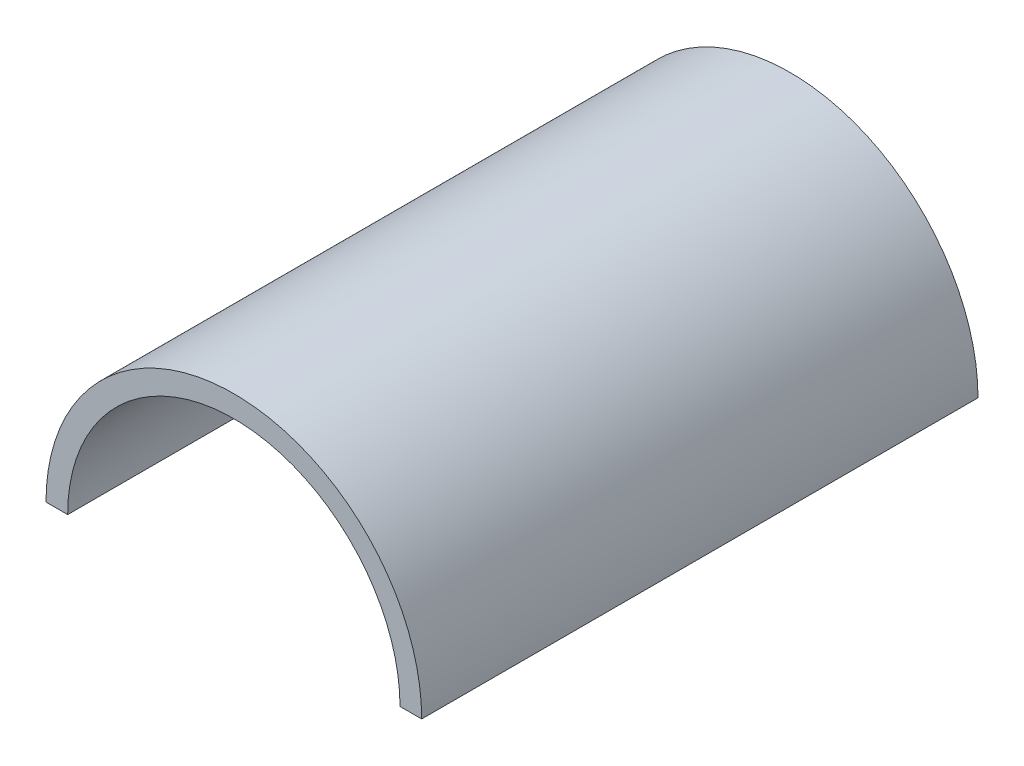
ISO-10303-21;
HEADER;
FILE_DESCRIPTION(('STEP AP214'),'2;1');
FILE_NAME('part.step','',(''),(''),'','','');
FILE_SCHEMA(('AUTOMOTIVE_DESIGN { 1 0 10303 214 1 1 1 1 }'));
ENDSEC;
DATA;
#1=APPLICATION_CONTEXT('core data for automotive mechanical design processes');
#2=APPLICATION_PROTOCOL_DEFINITION('international standard','automotive_design',2000,#1);
#3=PRODUCT_CONTEXT('',#1,'mechanical');
#4=PRODUCT('Part','Part','',(#3));
#5=PRODUCT_RELATED_PRODUCT_CATEGORY('part','',(#4));
#6=PRODUCT_DEFINITION_FORMATION('','',#4);
#7=PRODUCT_DEFINITION_CONTEXT('part definition',#1,'design');
#8=PRODUCT_DEFINITION('design','',#6,#7);
#9=PRODUCT_DEFINITION_SHAPE('','',#8);
#10=(LENGTH_UNIT() NAMED_UNIT(*) SI_UNIT(.MILLI.,.METRE.));
#11=(NAMED_UNIT(*) PLANE_ANGLE_UNIT() SI_UNIT($,.RADIAN.));
#12=(NAMED_UNIT(*) SI_UNIT($,.STERADIAN.) SOLID_ANGLE_UNIT());
#13=UNCERTAINTY_MEASURE_WITH_UNIT(LENGTH_MEASURE(1.E-05),#10,'distance_accuracy_value','');
#14=(GEOMETRIC_REPRESENTATION_CONTEXT(3) GLOBAL_UNCERTAINTY_ASSIGNED_CONTEXT((#13)) GLOBAL_UNIT_ASSIGNED_CONTEXT((#10,
#11,#12)) REPRESENTATION_CONTEXT('',''));
#15=CARTESIAN_POINT('',(0.,0.,0.));
#16=DIRECTION('',(0.,0.,1.));
#17=DIRECTION('',(1.,0.,0.));
#18=AXIS2_PLACEMENT_3D('',#15,#16,#17);
#19=CARTESIAN_POINT('',(0.,0.,77.));
#20=DIRECTION('',(0.,0.,-1.));
#21=DIRECTION('',(-1.,0.,0.));
#22=AXIS2_PLACEMENT_3D('',#19,#20,#21);
#23=CYLINDRICAL_SURFACE('',#22,23.);
#24=CARTESIAN_POINT('',(0.,0.,0.));
#25=DIRECTION('',(0.,0.,-1.));
#26=DIRECTION('',(1.,0.,0.));
#27=AXIS2_PLACEMENT_3D('',#24,#25,#26);
#28=CIRCLE('',#27,23.);
#29=CARTESIAN_POINT('',(-23.,0.,0.));
#30=VERTEX_POINT('',#29);
#31=CARTESIAN_POINT('',(23.,0.,0.));
#32=VERTEX_POINT('',#31);
#33=EDGE_CURVE('E107',#30,#32,#28,.T.);
#34=ORIENTED_EDGE('',*,*,#33,.T.);
#35=DIRECTION('',(0.,0.,-1.));
#36=VECTOR('',#35,1.);
#37=CARTESIAN_POINT('',(23.,0.,77.));
#38=LINE('',#37,#36);
#39=CARTESIAN_POINT('',(23.,0.,77.));
#40=VERTEX_POINT('',#39);
#41=EDGE_CURVE('E11',#40,#32,#38,.T.);
#42=ORIENTED_EDGE('',*,*,#41,.F.);
#43=CARTESIAN_POINT('',(0.,0.,77.));
#44=DIRECTION('',(0.,0.,-1.));
#45=DIRECTION('',(1.,0.,0.));
#46=AXIS2_PLACEMENT_3D('',#43,#44,#45);
#47=CIRCLE('',#46,23.);
#48=CARTESIAN_POINT('',(-23.,0.,77.));
#49=VERTEX_POINT('',#48);
#50=EDGE_CURVE('E91',#49,#40,#47,.T.);
#51=ORIENTED_EDGE('',*,*,#50,.F.);
#52=DIRECTION('',(0.,0.,-1.));
#53=VECTOR('',#52,1.);
#54=CARTESIAN_POINT('',(-23.,0.,77.));
#55=LINE('',#54,#53);
#56=EDGE_CURVE('E103',#49,#30,#55,.T.);
#57=ORIENTED_EDGE('',*,*,#56,.T.);
#58=EDGE_LOOP('',(#34,#42,#51,#57));
#59=FACE_BOUND('',#58,.T.);
#60=ADVANCED_FACE('F39',(#59),#23,.F.);
#61=CARTESIAN_POINT('',(23.,0.,77.));
#62=DIRECTION('',(0.,1.,0.));
#63=DIRECTION('',(0.,0.,1.));
#64=AXIS2_PLACEMENT_3D('',#61,#62,#63);
#65=PLANE('',#64);
#66=DIRECTION('',(1.,0.,0.));
#67=VECTOR('',#66,1.);
#68=CARTESIAN_POINT('',(23.,0.,0.));
#69=LINE('',#68,#67);
#70=CARTESIAN_POINT('',(26.,0.,0.));
#71=VERTEX_POINT('',#70);
#72=EDGE_CURVE('E96',#32,#71,#69,.T.);
#73=ORIENTED_EDGE('',*,*,#72,.T.);
#74=DIRECTION('',(0.,0.,-1.));
#75=VECTOR('',#74,1.);
#76=CARTESIAN_POINT('',(26.,0.,77.));
#77=LINE('',#76,#75);
#78=CARTESIAN_POINT('',(26.,0.,77.));
#79=VERTEX_POINT('',#78);
#80=EDGE_CURVE('E48',#79,#71,#77,.T.);
#81=ORIENTED_EDGE('',*,*,#80,.F.);
#82=DIRECTION('',(1.,0.,0.));
#83=VECTOR('',#82,1.);
#84=CARTESIAN_POINT('',(23.,0.,77.));
#85=LINE('',#84,#83);
#86=EDGE_CURVE('E86',#40,#79,#85,.T.);
#87=ORIENTED_EDGE('',*,*,#86,.F.);
#88=ORIENTED_EDGE('',*,*,#41,.T.);
#89=EDGE_LOOP('',(#73,#81,#87,#88));
#90=FACE_BOUND('',#89,.T.);
#91=ADVANCED_FACE('F95',(#90),#65,.F.);
#92=CARTESIAN_POINT('',(0.,0.,77.));
#93=DIRECTION('',(0.,0.,-1.));
#94=DIRECTION('',(-1.,0.,0.));
#95=AXIS2_PLACEMENT_3D('',#92,#93,#94);
#96=CYLINDRICAL_SURFACE('',#95,26.);
#97=CARTESIAN_POINT('',(0.,0.,0.));
#98=DIRECTION('',(0.,0.,1.));
#99=DIRECTION('',(1.,0.,0.));
#100=AXIS2_PLACEMENT_3D('',#97,#98,#99);
#101=CIRCLE('',#100,26.);
#102=CARTESIAN_POINT('',(-26.,0.,0.));
#103=VERTEX_POINT('',#102);
#104=EDGE_CURVE('E73',#71,#103,#101,.T.);
#105=ORIENTED_EDGE('',*,*,#104,.T.);
#106=DIRECTION('',(0.,0.,-1.));
#107=VECTOR('',#106,1.);
#108=CARTESIAN_POINT('',(-26.,0.,77.));
#109=LINE('',#108,#107);
#110=CARTESIAN_POINT('',(-26.,0.,77.));
#111=VERTEX_POINT('',#110);
#112=EDGE_CURVE('E98',#111,#103,#109,.T.);
#113=ORIENTED_EDGE('',*,*,#112,.F.);
#114=CARTESIAN_POINT('',(0.,0.,77.));
#115=DIRECTION('',(0.,0.,1.));
#116=DIRECTION('',(1.,0.,0.));
#117=AXIS2_PLACEMENT_3D('',#114,#115,#116);
#118=CIRCLE('',#117,26.);
#119=EDGE_CURVE('E89',#79,#111,#118,.T.);
#120=ORIENTED_EDGE('',*,*,#119,.F.);
#121=ORIENTED_EDGE('',*,*,#80,.T.);
#122=EDGE_LOOP('',(#105,#113,#120,#121));
#123=FACE_BOUND('',#122,.T.);
#124=ADVANCED_FACE('F99',(#123),#96,.T.);
#125=CARTESIAN_POINT('',(-23.,0.,77.));
#126=DIRECTION('',(0.,1.,0.));
#127=DIRECTION('',(0.,0.,1.));
#128=AXIS2_PLACEMENT_3D('',#125,#126,#127);
#129=PLANE('',#128);
#130=DIRECTION('',(1.,0.,0.));
#131=VECTOR('',#130,1.);
#132=CARTESIAN_POINT('',(-23.,0.,0.));
#133=LINE('',#132,#131);
#134=EDGE_CURVE('E79',#103,#30,#133,.T.);
#135=ORIENTED_EDGE('',*,*,#134,.T.);
#136=ORIENTED_EDGE('',*,*,#56,.F.);
#137=DIRECTION('',(1.,0.,0.));
#138=VECTOR('',#137,1.);
#139=CARTESIAN_POINT('',(-23.,0.,77.));
#140=LINE('',#139,#138);
#141=EDGE_CURVE('E56',#111,#49,#140,.T.);
#142=ORIENTED_EDGE('',*,*,#141,.F.);
#143=ORIENTED_EDGE('',*,*,#112,.T.);
#144=EDGE_LOOP('',(#135,#136,#142,#143));
#145=FACE_BOUND('',#144,.T.);
#146=ADVANCED_FACE('F120',(#145),#129,.F.);
#147=CARTESIAN_POINT('',(0.,0.,77.));
#148=DIRECTION('',(0.,0.,1.));
#149=DIRECTION('',(1.,0.,0.));
#150=AXIS2_PLACEMENT_3D('',#147,#148,#149);
#151=PLANE('',#150);
#152=ORIENTED_EDGE('',*,*,#50,.T.);
#153=ORIENTED_EDGE('',*,*,#86,.T.);
#154=ORIENTED_EDGE('',*,*,#119,.T.);
#155=ORIENTED_EDGE('',*,*,#141,.T.);
#156=EDGE_LOOP('',(#152,#153,#154,#155));
#157=FACE_BOUND('',#156,.T.);
#158=ADVANCED_FACE('F87',(#157),#151,.T.);
#159=CARTESIAN_POINT('',(0.,0.,0.));
#160=DIRECTION('',(0.,0.,1.));
#161=DIRECTION('',(1.,0.,0.));
#162=AXIS2_PLACEMENT_3D('',#159,#160,#161);
#163=PLANE('',#162);
#164=ORIENTED_EDGE('',*,*,#33,.F.);
#165=ORIENTED_EDGE('',*,*,#134,.F.);
#166=ORIENTED_EDGE('',*,*,#104,.F.);
#167=ORIENTED_EDGE('',*,*,#72,.F.);
#168=EDGE_LOOP('',(#164,#165,#166,#167));
#169=FACE_BOUND('',#168,.T.);
#170=ADVANCED_FACE('F123',(#169),#163,.F.);
#171=CLOSED_SHELL('',(#60,#91,#124,#146,#158,#170));
#172=MANIFOLD_SOLID_BREP('B2',#171);
#173=ADVANCED_BREP_SHAPE_REPRESENTATION('',(#18,#172),#14);
#174=SHAPE_DEFINITION_REPRESENTATION(#9,#173);
ENDSEC;
END-ISO-10303-21;
